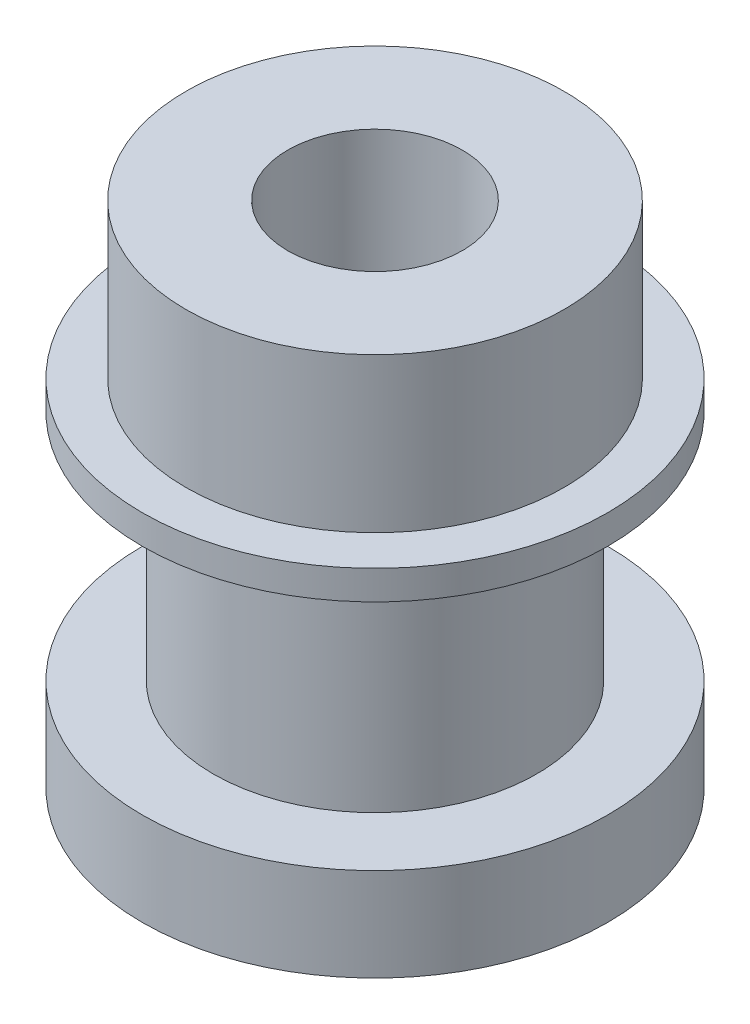
ISO-10303-21;
HEADER;
FILE_DESCRIPTION(('STEP AP214'),'2;1');
FILE_NAME('part.step','',(''),(''),'','','');
FILE_SCHEMA(('AUTOMOTIVE_DESIGN { 1 0 10303 214 1 1 1 1 }'));
ENDSEC;
DATA;
#1=APPLICATION_CONTEXT('core data for automotive mechanical design processes');
#2=APPLICATION_PROTOCOL_DEFINITION('international standard','automotive_design',2000,#1);
#3=PRODUCT_CONTEXT('',#1,'mechanical');
#4=PRODUCT('Part','Part','',(#3));
#5=PRODUCT_RELATED_PRODUCT_CATEGORY('part','',(#4));
#6=PRODUCT_DEFINITION_FORMATION('','',#4);
#7=PRODUCT_DEFINITION_CONTEXT('part definition',#1,'design');
#8=PRODUCT_DEFINITION('design','',#6,#7);
#9=PRODUCT_DEFINITION_SHAPE('','',#8);
#10=(LENGTH_UNIT() NAMED_UNIT(*) SI_UNIT(.MILLI.,.METRE.));
#11=(NAMED_UNIT(*) PLANE_ANGLE_UNIT() SI_UNIT($,.RADIAN.));
#12=(NAMED_UNIT(*) SI_UNIT($,.STERADIAN.) SOLID_ANGLE_UNIT());
#13=UNCERTAINTY_MEASURE_WITH_UNIT(LENGTH_MEASURE(1.E-05),#10,'distance_accuracy_value','');
#14=(GEOMETRIC_REPRESENTATION_CONTEXT(3) GLOBAL_UNCERTAINTY_ASSIGNED_CONTEXT((#13)) GLOBAL_UNIT_ASSIGNED_CONTEXT((#10,
#11,#12)) REPRESENTATION_CONTEXT('',''));
#15=CARTESIAN_POINT('',(0.,0.,0.));
#16=DIRECTION('',(0.,0.,1.));
#17=DIRECTION('',(1.,0.,0.));
#18=AXIS2_PLACEMENT_3D('',#15,#16,#17);
#19=CARTESIAN_POINT('',(0.,0.,0.));
#20=DIRECTION('',(0.,1.,0.));
#21=DIRECTION('',(0.,0.,1.));
#22=AXIS2_PLACEMENT_3D('',#19,#20,#21);
#23=PLANE('',#22);
#24=CARTESIAN_POINT('',(0.,0.,0.));
#25=DIRECTION('',(0.,1.,0.));
#26=DIRECTION('',(0.,0.,1.));
#27=AXIS2_PLACEMENT_3D('',#24,#25,#26);
#28=CIRCLE('',#27,3.);
#29=CARTESIAN_POINT('',(0.,0.,3.));
#30=VERTEX_POINT('',#29);
#31=EDGE_CURVE('E48',#30,#30,#28,.T.);
#32=ORIENTED_EDGE('',*,*,#31,.T.);
#33=EDGE_LOOP('',(#32));
#34=FACE_BOUND('',#33,.T.);
#35=CARTESIAN_POINT('',(0.,0.,0.));
#36=DIRECTION('',(0.,1.,0.));
#37=DIRECTION('',(0.,0.,1.));
#38=AXIS2_PLACEMENT_3D('',#35,#36,#37);
#39=CIRCLE('',#38,8.);
#40=CARTESIAN_POINT('',(0.,0.,8.));
#41=VERTEX_POINT('',#40);
#42=EDGE_CURVE('E65',#41,#41,#39,.T.);
#43=ORIENTED_EDGE('',*,*,#42,.F.);
#44=EDGE_LOOP('',(#43));
#45=FACE_BOUND('',#44,.T.);
#46=ADVANCED_FACE('F30',(#34,#45),#23,.F.);
#47=CARTESIAN_POINT('',(0.,3.2,0.));
#48=DIRECTION('',(0.,1.,0.));
#49=DIRECTION('',(0.,0.,1.));
#50=AXIS2_PLACEMENT_3D('',#47,#48,#49);
#51=PLANE('',#50);
#52=CARTESIAN_POINT('',(0.,3.2,0.));
#53=DIRECTION('',(0.,1.,0.));
#54=DIRECTION('',(0.,0.,1.));
#55=AXIS2_PLACEMENT_3D('',#52,#53,#54);
#56=CIRCLE('',#55,5.56);
#57=CARTESIAN_POINT('',(0.,3.2,5.56));
#58=VERTEX_POINT('',#57);
#59=EDGE_CURVE('E38',#58,#58,#56,.T.);
#60=ORIENTED_EDGE('',*,*,#59,.F.);
#61=EDGE_LOOP('',(#60));
#62=FACE_BOUND('',#61,.T.);
#63=CARTESIAN_POINT('',(0.,3.2,0.));
#64=DIRECTION('',(0.,1.,0.));
#65=DIRECTION('',(0.,0.,1.));
#66=AXIS2_PLACEMENT_3D('',#63,#64,#65);
#67=CIRCLE('',#66,8.);
#68=CARTESIAN_POINT('',(0.,3.2,8.));
#69=VERTEX_POINT('',#68);
#70=EDGE_CURVE('E62',#69,#69,#67,.T.);
#71=ORIENTED_EDGE('',*,*,#70,.T.);
#72=EDGE_LOOP('',(#71));
#73=FACE_BOUND('',#72,.T.);
#74=ADVANCED_FACE('F71',(#62,#73),#51,.T.);
#75=CARTESIAN_POINT('',(0.,11.2,0.));
#76=DIRECTION('',(0.,1.,0.));
#77=DIRECTION('',(0.,0.,1.));
#78=AXIS2_PLACEMENT_3D('',#75,#76,#77);
#79=PLANE('',#78);
#80=CARTESIAN_POINT('',(0.,11.2,0.));
#81=DIRECTION('',(0.,1.,0.));
#82=DIRECTION('',(0.,0.,1.));
#83=AXIS2_PLACEMENT_3D('',#80,#81,#82);
#84=CIRCLE('',#83,5.56);
#85=CARTESIAN_POINT('',(0.,11.2,5.56));
#86=VERTEX_POINT('',#85);
#87=EDGE_CURVE('E43',#86,#86,#84,.T.);
#88=ORIENTED_EDGE('',*,*,#87,.T.);
#89=EDGE_LOOP('',(#88));
#90=FACE_BOUND('',#89,.T.);
#91=CARTESIAN_POINT('',(0.,11.2,0.));
#92=DIRECTION('',(0.,1.,0.));
#93=DIRECTION('',(0.,0.,1.));
#94=AXIS2_PLACEMENT_3D('',#91,#92,#93);
#95=CIRCLE('',#94,8.);
#96=CARTESIAN_POINT('',(0.,11.2,8.));
#97=VERTEX_POINT('',#96);
#98=EDGE_CURVE('E59',#97,#97,#95,.T.);
#99=ORIENTED_EDGE('',*,*,#98,.F.);
#100=EDGE_LOOP('',(#99));
#101=FACE_BOUND('',#100,.T.);
#102=ADVANCED_FACE('F84',(#90,#101),#79,.F.);
#103=CARTESIAN_POINT('',(0.,3.2,0.));
#104=DIRECTION('',(0.,1.,0.));
#105=DIRECTION('',(0.,0.,1.));
#106=AXIS2_PLACEMENT_3D('',#103,#104,#105);
#107=CYLINDRICAL_SURFACE('',#106,5.56);
#108=ORIENTED_EDGE('',*,*,#59,.T.);
#109=EDGE_LOOP('',(#108));
#110=FACE_BOUND('',#109,.T.);
#111=ORIENTED_EDGE('',*,*,#87,.F.);
#112=EDGE_LOOP('',(#111));
#113=FACE_BOUND('',#112,.T.);
#114=ADVANCED_FACE('F91',(#110,#113),#107,.T.);
#115=CARTESIAN_POINT('',(0.,17.5,0.));
#116=DIRECTION('',(0.,1.,0.));
#117=DIRECTION('',(0.,0.,1.));
#118=AXIS2_PLACEMENT_3D('',#115,#116,#117);
#119=PLANE('',#118);
#120=CARTESIAN_POINT('',(0.,17.5,0.));
#121=DIRECTION('',(0.,1.,0.));
#122=DIRECTION('',(0.,0.,1.));
#123=AXIS2_PLACEMENT_3D('',#120,#121,#122);
#124=CIRCLE('',#123,3.);
#125=CARTESIAN_POINT('',(0.,17.5,3.));
#126=VERTEX_POINT('',#125);
#127=EDGE_CURVE('E46',#126,#126,#124,.T.);
#128=ORIENTED_EDGE('',*,*,#127,.F.);
#129=EDGE_LOOP('',(#128));
#130=FACE_BOUND('',#129,.T.);
#131=CARTESIAN_POINT('',(0.,17.5,0.));
#132=DIRECTION('',(0.,1.,0.));
#133=DIRECTION('',(0.,0.,1.));
#134=AXIS2_PLACEMENT_3D('',#131,#132,#133);
#135=CIRCLE('',#134,6.5);
#136=CARTESIAN_POINT('',(0.,17.5,6.5));
#137=VERTEX_POINT('',#136);
#138=EDGE_CURVE('E10',#137,#137,#135,.T.);
#139=ORIENTED_EDGE('',*,*,#138,.T.);
#140=EDGE_LOOP('',(#139));
#141=FACE_BOUND('',#140,.T.);
#142=ADVANCED_FACE('F88',(#130,#141),#119,.T.);
#143=CARTESIAN_POINT('',(0.,17.5,0.));
#144=DIRECTION('',(0.,-1.,0.));
#145=DIRECTION('',(0.,0.,-1.));
#146=AXIS2_PLACEMENT_3D('',#143,#144,#145);
#147=CYLINDRICAL_SURFACE('',#146,6.5);
#148=CARTESIAN_POINT('',(0.,12.2,0.));
#149=DIRECTION('',(0.,1.,0.));
#150=DIRECTION('',(0.,0.,1.));
#151=AXIS2_PLACEMENT_3D('',#148,#149,#150);
#152=CIRCLE('',#151,6.5);
#153=CARTESIAN_POINT('',(0.,12.2,6.5));
#154=VERTEX_POINT('',#153);
#155=EDGE_CURVE('E34',#154,#154,#152,.T.);
#156=ORIENTED_EDGE('',*,*,#155,.T.);
#157=EDGE_LOOP('',(#156));
#158=FACE_BOUND('',#157,.T.);
#159=ORIENTED_EDGE('',*,*,#138,.F.);
#160=EDGE_LOOP('',(#159));
#161=FACE_BOUND('',#160,.T.);
#162=ADVANCED_FACE('F32',(#158,#161),#147,.T.);
#163=CARTESIAN_POINT('',(0.,0.,0.));
#164=DIRECTION('',(0.,1.,0.));
#165=DIRECTION('',(0.,0.,1.));
#166=AXIS2_PLACEMENT_3D('',#163,#164,#165);
#167=CYLINDRICAL_SURFACE('',#166,3.);
#168=ORIENTED_EDGE('',*,*,#127,.T.);
#169=EDGE_LOOP('',(#168));
#170=FACE_BOUND('',#169,.T.);
#171=ORIENTED_EDGE('',*,*,#31,.F.);
#172=EDGE_LOOP('',(#171));
#173=FACE_BOUND('',#172,.T.);
#174=ADVANCED_FACE('F99',(#170,#173),#167,.F.);
#175=CARTESIAN_POINT('',(0.,12.2,0.));
#176=DIRECTION('',(0.,1.,0.));
#177=DIRECTION('',(0.,0.,1.));
#178=AXIS2_PLACEMENT_3D('',#175,#176,#177);
#179=PLANE('',#178);
#180=ORIENTED_EDGE('',*,*,#155,.F.);
#181=EDGE_LOOP('',(#180));
#182=FACE_BOUND('',#181,.T.);
#183=CARTESIAN_POINT('',(0.,12.2,0.));
#184=DIRECTION('',(0.,1.,0.));
#185=DIRECTION('',(0.,0.,1.));
#186=AXIS2_PLACEMENT_3D('',#183,#184,#185);
#187=CIRCLE('',#186,8.);
#188=CARTESIAN_POINT('',(0.,12.2,8.));
#189=VERTEX_POINT('',#188);
#190=EDGE_CURVE('E57',#189,#189,#187,.T.);
#191=ORIENTED_EDGE('',*,*,#190,.T.);
#192=EDGE_LOOP('',(#191));
#193=FACE_BOUND('',#192,.T.);
#194=ADVANCED_FACE('F102',(#182,#193),#179,.T.);
#195=CARTESIAN_POINT('',(0.,12.2,0.));
#196=DIRECTION('',(0.,-1.,0.));
#197=DIRECTION('',(0.,0.,-1.));
#198=AXIS2_PLACEMENT_3D('',#195,#196,#197);
#199=CYLINDRICAL_SURFACE('',#198,8.);
#200=ORIENTED_EDGE('',*,*,#190,.F.);
#201=EDGE_LOOP('',(#200));
#202=FACE_BOUND('',#201,.T.);
#203=ORIENTED_EDGE('',*,*,#98,.T.);
#204=EDGE_LOOP('',(#203));
#205=FACE_BOUND('',#204,.T.);
#206=ADVANCED_FACE('F76',(#202,#205),#199,.T.);
#207=CARTESIAN_POINT('',(0.,3.2,0.));
#208=DIRECTION('',(0.,-1.,0.));
#209=DIRECTION('',(0.,0.,-1.));
#210=AXIS2_PLACEMENT_3D('',#207,#208,#209);
#211=CYLINDRICAL_SURFACE('',#210,8.);
#212=ORIENTED_EDGE('',*,*,#70,.F.);
#213=EDGE_LOOP('',(#212));
#214=FACE_BOUND('',#213,.T.);
#215=ORIENTED_EDGE('',*,*,#42,.T.);
#216=EDGE_LOOP('',(#215));
#217=FACE_BOUND('',#216,.T.);
#218=ADVANCED_FACE('F73',(#214,#217),#211,.T.);
#219=CLOSED_SHELL('',(#46,#74,#102,#114,#142,#162,#174,#194,#206,#218));
#220=MANIFOLD_SOLID_BREP('B2',#219);
#221=ADVANCED_BREP_SHAPE_REPRESENTATION('',(#18,#220),#14);
#222=SHAPE_DEFINITION_REPRESENTATION(#9,#221);
ENDSEC;
END-ISO-10303-21;
